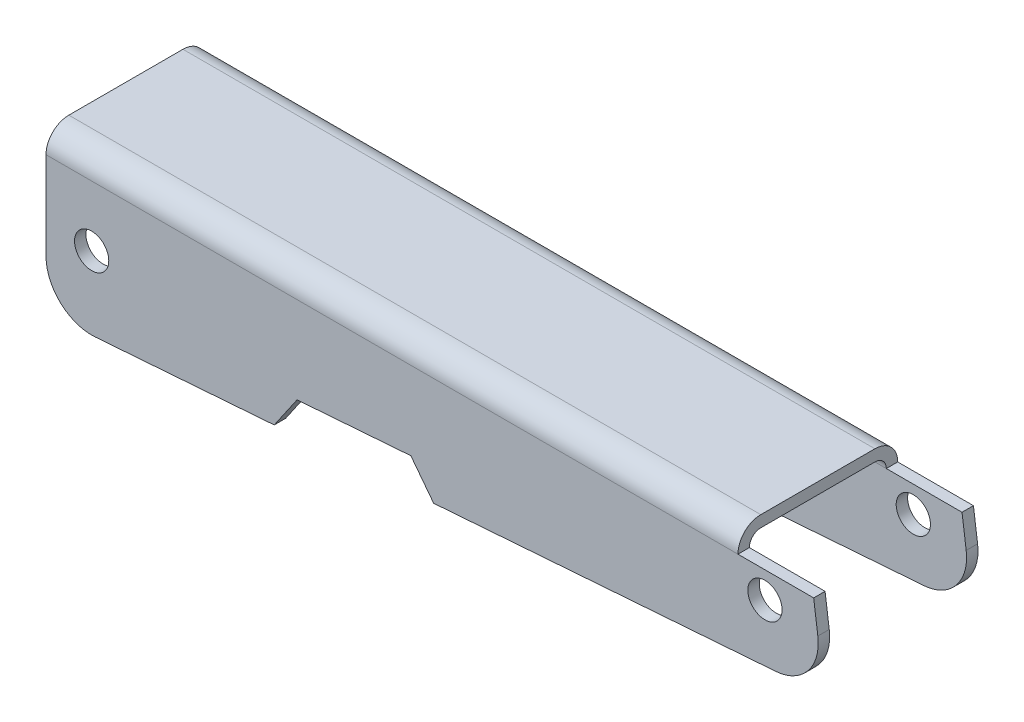
ISO-10303-21;
HEADER;
FILE_DESCRIPTION(('STEP AP214'),'2;1');
FILE_NAME('part.step','',(''),(''),'','','');
FILE_SCHEMA(('AUTOMOTIVE_DESIGN { 1 0 10303 214 1 1 1 1 }'));
ENDSEC;
DATA;
#1=APPLICATION_CONTEXT('core data for automotive mechanical design processes');
#2=APPLICATION_PROTOCOL_DEFINITION('international standard','automotive_design',2000,#1);
#3=PRODUCT_CONTEXT('',#1,'mechanical');
#4=PRODUCT('Part','Part','',(#3));
#5=PRODUCT_RELATED_PRODUCT_CATEGORY('part','',(#4));
#6=PRODUCT_DEFINITION_FORMATION('','',#4);
#7=PRODUCT_DEFINITION_CONTEXT('part definition',#1,'design');
#8=PRODUCT_DEFINITION('design','',#6,#7);
#9=PRODUCT_DEFINITION_SHAPE('','',#8);
#10=(LENGTH_UNIT() NAMED_UNIT(*) SI_UNIT(.MILLI.,.METRE.));
#11=(NAMED_UNIT(*) PLANE_ANGLE_UNIT() SI_UNIT($,.RADIAN.));
#12=(NAMED_UNIT(*) SI_UNIT($,.STERADIAN.) SOLID_ANGLE_UNIT());
#13=UNCERTAINTY_MEASURE_WITH_UNIT(LENGTH_MEASURE(1.E-05),#10,'distance_accuracy_value','');
#14=(GEOMETRIC_REPRESENTATION_CONTEXT(3) GLOBAL_UNCERTAINTY_ASSIGNED_CONTEXT((#13)) GLOBAL_UNIT_ASSIGNED_CONTEXT((#10,
#11,#12)) REPRESENTATION_CONTEXT('',''));
#15=CARTESIAN_POINT('',(0.,0.,0.));
#16=DIRECTION('',(0.,0.,1.));
#17=DIRECTION('',(1.,0.,0.));
#18=AXIS2_PLACEMENT_3D('',#15,#16,#17);
#19=CARTESIAN_POINT('',(5.2,-4.6196412483911,7.));
#20=DIRECTION('',(-0.991071249821234,-0.133333333333333,0.));
#21=DIRECTION('',(0.133333333333333,-0.991071249821234,0.));
#22=AXIS2_PLACEMENT_3D('',#19,#20,#21);
#23=PLANE('',#22);
#24=DIRECTION('',(-0.133333333333333,0.991071249821234,0.));
#25=VECTOR('',#24,1.);
#26=CARTESIAN_POINT('',(5.2,-4.6196412483911,-7.));
#27=LINE('',#26,#25);
#28=CARTESIAN_POINT('',(4.63402019570008,-0.412693908232891,-7.));
#29=VERTEX_POINT('',#28);
#30=CARTESIAN_POINT('',(4.26906911759852,2.3,-7.));
#31=VERTEX_POINT('',#30);
#32=EDGE_CURVE('E397',#29,#31,#27,.T.);
#33=ORIENTED_EDGE('',*,*,#32,.T.);
#34=DIRECTION('',(0.,0.,1.));
#35=VECTOR('',#34,1.);
#36=CARTESIAN_POINT('',(4.26906911759852,2.3,7.));
#37=LINE('',#36,#35);
#38=CARTESIAN_POINT('',(4.26906911759852,2.3,-6.));
#39=VERTEX_POINT('',#38);
#40=EDGE_CURVE('E499',#31,#39,#37,.T.);
#41=ORIENTED_EDGE('',*,*,#40,.T.);
#42=DIRECTION('',(-0.133333333333333,0.991071249821234,0.));
#43=VECTOR('',#42,1.);
#44=CARTESIAN_POINT('',(5.2,-4.6196412483911,-6.));
#45=LINE('',#44,#43);
#46=CARTESIAN_POINT('',(4.63402019570008,-0.412693908232891,-6.));
#47=VERTEX_POINT('',#46);
#48=EDGE_CURVE('E338',#47,#39,#45,.T.);
#49=ORIENTED_EDGE('',*,*,#48,.F.);
#50=DIRECTION('',(0.,0.,-1.));
#51=VECTOR('',#50,1.);
#52=CARTESIAN_POINT('',(4.63402019570008,-0.412693908232891,7.));
#53=LINE('',#52,#51);
#54=EDGE_CURVE('E304',#47,#29,#53,.T.);
#55=ORIENTED_EDGE('',*,*,#54,.T.);
#56=EDGE_LOOP('',(#33,#41,#49,#55));
#57=FACE_BOUND('',#56,.T.);
#58=ADVANCED_FACE('F69',(#57),#23,.F.);
#59=CARTESIAN_POINT('',(-63.,-9.70000000000001,7.));
#60=DIRECTION('',(-0.0742862392645329,0.997236960133314,0.));
#61=DIRECTION('',(-0.997236960133314,-0.0742862392645329,0.));
#62=AXIS2_PLACEMENT_3D('',#59,#60,#61);
#63=PLANE('',#62);
#64=DIRECTION('',(0.997236960133314,0.0742862392645329,0.));
#65=VECTOR('',#64,1.);
#66=CARTESIAN_POINT('',(-63.,-9.70000000000001,-7.));
#67=LINE('',#66,#65);
#68=CARTESIAN_POINT('',(-58.7028550429419,-9.3798968036727,-7.));
#69=VERTEX_POINT('',#68);
#70=CARTESIAN_POINT('',(-43.,-8.21015872386836,-7.));
#71=VERTEX_POINT('',#70);
#72=EDGE_CURVE('E330',#69,#71,#67,.T.);
#73=ORIENTED_EDGE('',*,*,#72,.T.);
#74=DIRECTION('',(0.,0.,1.));
#75=VECTOR('',#74,1.);
#76=CARTESIAN_POINT('',(-43.,-8.21015872386836,-7.));
#77=LINE('',#76,#75);
#78=CARTESIAN_POINT('',(-43.,-8.21015872386836,-6.));
#79=VERTEX_POINT('',#78);
#80=EDGE_CURVE('E317',#71,#79,#77,.T.);
#81=ORIENTED_EDGE('',*,*,#80,.T.);
#82=DIRECTION('',(0.997236960133314,0.0742862392645329,0.));
#83=VECTOR('',#82,1.);
#84=CARTESIAN_POINT('',(-63.,-9.70000000000001,-6.));
#85=LINE('',#84,#83);
#86=CARTESIAN_POINT('',(-58.7028550429419,-9.3798968036727,-6.));
#87=VERTEX_POINT('',#86);
#88=EDGE_CURVE('E327',#87,#79,#85,.T.);
#89=ORIENTED_EDGE('',*,*,#88,.F.);
#90=DIRECTION('',(0.,0.,-1.));
#91=VECTOR('',#90,1.);
#92=CARTESIAN_POINT('',(-58.7028550429419,-9.3798968036727,7.));
#93=LINE('',#92,#91);
#94=EDGE_CURVE('E287',#87,#69,#93,.T.);
#95=ORIENTED_EDGE('',*,*,#94,.T.);
#96=EDGE_LOOP('',(#73,#81,#89,#95));
#97=FACE_BOUND('',#96,.T.);
#98=ADVANCED_FACE('F326',(#97),#63,.F.);
#99=DIRECTION('',(0.997236960133314,0.0742862392645329,0.));
#100=VECTOR('',#99,1.);
#101=CARTESIAN_POINT('',(-63.,-9.70000000000001,6.));
#102=LINE('',#101,#100);
#103=CARTESIAN_POINT('',(-58.7028550429419,-9.3798968036727,6.));
#104=VERTEX_POINT('',#103);
#105=CARTESIAN_POINT('',(-43.,-8.21015872386836,6.));
#106=VERTEX_POINT('',#105);
#107=EDGE_CURVE('E355',#104,#106,#102,.T.);
#108=ORIENTED_EDGE('',*,*,#107,.T.);
#109=CARTESIAN_POINT('',(-43.,-8.21015872386836,7.));
#110=VERTEX_POINT('',#109);
#111=EDGE_CURVE('E332',#106,#110,#77,.T.);
#112=ORIENTED_EDGE('',*,*,#111,.T.);
#113=DIRECTION('',(0.997236960133314,0.0742862392645329,0.));
#114=VECTOR('',#113,1.);
#115=CARTESIAN_POINT('',(-63.,-9.70000000000001,7.));
#116=LINE('',#115,#114);
#117=CARTESIAN_POINT('',(-58.7028550429419,-9.3798968036727,7.));
#118=VERTEX_POINT('',#117);
#119=EDGE_CURVE('E388',#118,#110,#116,.T.);
#120=ORIENTED_EDGE('',*,*,#119,.F.);
#121=EDGE_CURVE('E288',#118,#104,#93,.T.);
#122=ORIENTED_EDGE('',*,*,#121,.T.);
#123=EDGE_LOOP('',(#108,#112,#120,#122));
#124=FACE_BOUND('',#123,.T.);
#125=ADVANCED_FACE('F539',(#124),#63,.F.);
#126=CARTESIAN_POINT('',(-29.0276303986669,-7.1693280759967,-6.));
#127=VERTEX_POINT('',#126);
#128=CARTESIAN_POINT('',(0.966880153473293,-4.93497508209948,-6.));
#129=VERTEX_POINT('',#128);
#130=EDGE_CURVE('E339',#127,#129,#85,.T.);
#131=ORIENTED_EDGE('',*,*,#130,.F.);
#132=DIRECTION('',(0.,0.,1.));
#133=VECTOR('',#132,1.);
#134=CARTESIAN_POINT('',(-29.0276303986669,-7.16932807599671,-7.));
#135=LINE('',#134,#133);
#136=CARTESIAN_POINT('',(-29.0276303986669,-7.16932807599671,-7.));
#137=VERTEX_POINT('',#136);
#138=EDGE_CURVE('E92',#137,#127,#135,.T.);
#139=ORIENTED_EDGE('',*,*,#138,.F.);
#140=CARTESIAN_POINT('',(0.966880153473279,-4.93497508209948,-7.));
#141=VERTEX_POINT('',#140);
#142=EDGE_CURVE('E385',#137,#141,#67,.T.);
#143=ORIENTED_EDGE('',*,*,#142,.T.);
#144=DIRECTION('',(0.,0.,-1.));
#145=VECTOR('',#144,1.);
#146=CARTESIAN_POINT('',(0.966880153473293,-4.93497508209948,7.));
#147=LINE('',#146,#145);
#148=EDGE_CURVE('E281',#141,#129,#147,.F.);
#149=ORIENTED_EDGE('',*,*,#148,.T.);
#150=EDGE_LOOP('',(#131,#139,#143,#149));
#151=FACE_BOUND('',#150,.T.);
#152=ADVANCED_FACE('F543',(#151),#63,.F.);
#153=DIRECTION('',(-0.133333333333333,0.991071249821234,0.));
#154=VECTOR('',#153,1.);
#155=CARTESIAN_POINT('',(5.2,-4.6196412483911,6.));
#156=LINE('',#155,#154);
#157=CARTESIAN_POINT('',(4.63402019570008,-0.412693908232891,6.));
#158=VERTEX_POINT('',#157);
#159=CARTESIAN_POINT('',(4.26906911759852,2.3,6.));
#160=VERTEX_POINT('',#159);
#161=EDGE_CURVE('E351',#158,#160,#156,.T.);
#162=ORIENTED_EDGE('',*,*,#161,.T.);
#163=CARTESIAN_POINT('',(4.26906911759852,2.3,7.));
#164=VERTEX_POINT('',#163);
#165=EDGE_CURVE('E496',#160,#164,#37,.T.);
#166=ORIENTED_EDGE('',*,*,#165,.T.);
#167=DIRECTION('',(-0.133333333333333,0.991071249821234,0.));
#168=VECTOR('',#167,1.);
#169=CARTESIAN_POINT('',(5.2,-4.6196412483911,7.));
#170=LINE('',#169,#168);
#171=CARTESIAN_POINT('',(4.63402019570008,-0.412693908232891,7.));
#172=VERTEX_POINT('',#171);
#173=EDGE_CURVE('E278',#172,#164,#170,.T.);
#174=ORIENTED_EDGE('',*,*,#173,.F.);
#175=EDGE_CURVE('E305',#172,#158,#53,.T.);
#176=ORIENTED_EDGE('',*,*,#175,.T.);
#177=EDGE_LOOP('',(#162,#166,#174,#176));
#178=FACE_BOUND('',#177,.T.);
#179=ADVANCED_FACE('F495',(#178),#23,.F.);
#180=CARTESIAN_POINT('',(-59.,-3.00000000000001,7.));
#181=DIRECTION('',(0.,0.,-1.));
#182=DIRECTION('',(-1.,0.,0.));
#183=AXIS2_PLACEMENT_3D('',#180,#181,#182);
#184=CYLINDRICAL_SURFACE('',#183,1.5);
#185=CARTESIAN_POINT('',(-59.,-3.00000000000001,-7.));
#186=DIRECTION('',(0.,0.,1.));
#187=DIRECTION('',(1.,0.,0.));
#188=AXIS2_PLACEMENT_3D('',#185,#186,#187);
#189=CIRCLE('',#188,1.5);
#190=CARTESIAN_POINT('',(-57.5,-3.00000000000001,-7.));
#191=VERTEX_POINT('',#190);
#192=EDGE_CURVE('E379',#191,#191,#189,.T.);
#193=ORIENTED_EDGE('',*,*,#192,.F.);
#194=EDGE_LOOP('',(#193));
#195=FACE_BOUND('',#194,.T.);
#196=CARTESIAN_POINT('',(-59.,-3.00000000000001,-6.));
#197=DIRECTION('',(0.,0.,1.));
#198=DIRECTION('',(1.,0.,0.));
#199=AXIS2_PLACEMENT_3D('',#196,#197,#198);
#200=CIRCLE('',#199,1.5);
#201=CARTESIAN_POINT('',(-57.5,-3.00000000000001,-6.));
#202=VERTEX_POINT('',#201);
#203=EDGE_CURVE('E369',#202,#202,#200,.T.);
#204=ORIENTED_EDGE('',*,*,#203,.T.);
#205=EDGE_LOOP('',(#204));
#206=FACE_BOUND('',#205,.T.);
#207=ADVANCED_FACE('F542',(#195,#206),#184,.F.);
#208=CARTESIAN_POINT('',(0.,0.,7.));
#209=DIRECTION('',(0.,0.,-1.));
#210=DIRECTION('',(-1.,0.,0.));
#211=AXIS2_PLACEMENT_3D('',#208,#209,#210);
#212=CYLINDRICAL_SURFACE('',#211,1.5);
#213=CARTESIAN_POINT('',(0.,0.,-7.));
#214=DIRECTION('',(0.,0.,1.));
#215=DIRECTION('',(1.,0.,0.));
#216=AXIS2_PLACEMENT_3D('',#213,#214,#215);
#217=CIRCLE('',#216,1.5);
#218=CARTESIAN_POINT('',(1.5,0.,-7.));
#219=VERTEX_POINT('',#218);
#220=EDGE_CURVE('E365',#219,#219,#217,.T.);
#221=ORIENTED_EDGE('',*,*,#220,.F.);
#222=EDGE_LOOP('',(#221));
#223=FACE_BOUND('',#222,.T.);
#224=CARTESIAN_POINT('',(0.,0.,-6.));
#225=DIRECTION('',(0.,0.,1.));
#226=DIRECTION('',(1.,0.,0.));
#227=AXIS2_PLACEMENT_3D('',#224,#225,#226);
#228=CIRCLE('',#227,1.5);
#229=CARTESIAN_POINT('',(1.5,0.,-6.));
#230=VERTEX_POINT('',#229);
#231=EDGE_CURVE('E370',#230,#230,#228,.T.);
#232=ORIENTED_EDGE('',*,*,#231,.T.);
#233=EDGE_LOOP('',(#232));
#234=FACE_BOUND('',#233,.T.);
#235=ADVANCED_FACE('F548',(#223,#234),#212,.F.);
#236=CARTESIAN_POINT('',(-59.,-5.39094896313944,7.));
#237=DIRECTION('',(0.,0.,-1.));
#238=DIRECTION('',(-1.,0.,0.));
#239=AXIS2_PLACEMENT_3D('',#236,#237,#238);
#240=CYLINDRICAL_SURFACE('',#239,4.);
#241=DIRECTION('',(0.,0.,-1.));
#242=VECTOR('',#241,1.);
#243=CARTESIAN_POINT('',(-63.,-5.39094896313944,7.));
#244=LINE('',#243,#242);
#245=CARTESIAN_POINT('',(-63.,-5.39094896313944,6.));
#246=VERTEX_POINT('',#245);
#247=CARTESIAN_POINT('',(-63.,-5.39094896313944,7.));
#248=VERTEX_POINT('',#247);
#249=EDGE_CURVE('E296',#246,#248,#244,.F.);
#250=ORIENTED_EDGE('',*,*,#249,.F.);
#251=CARTESIAN_POINT('',(-59.,-5.39094896313944,6.));
#252=DIRECTION('',(0.,0.,1.));
#253=DIRECTION('',(1.,0.,0.));
#254=AXIS2_PLACEMENT_3D('',#251,#252,#253);
#255=CIRCLE('',#254,4.);
#256=EDGE_CURVE('E359',#246,#104,#255,.T.);
#257=ORIENTED_EDGE('',*,*,#256,.T.);
#258=ORIENTED_EDGE('',*,*,#121,.F.);
#259=CARTESIAN_POINT('',(-59.,-5.39094896313944,7.));
#260=DIRECTION('',(0.,0.,1.));
#261=DIRECTION('',(1.,0.,0.));
#262=AXIS2_PLACEMENT_3D('',#259,#260,#261);
#263=CIRCLE('',#262,4.);
#264=EDGE_CURVE('E302',#248,#118,#263,.T.);
#265=ORIENTED_EDGE('',*,*,#264,.F.);
#266=EDGE_LOOP('',(#250,#257,#258,#265));
#267=FACE_BOUND('',#266,.T.);
#268=ADVANCED_FACE('F627',(#267),#240,.T.);
#269=ORIENTED_EDGE('',*,*,#94,.F.);
#270=CARTESIAN_POINT('',(-59.,-5.39094896313944,-6.));
#271=DIRECTION('',(0.,0.,1.));
#272=DIRECTION('',(1.,0.,0.));
#273=AXIS2_PLACEMENT_3D('',#270,#271,#272);
#274=CIRCLE('',#273,4.);
#275=CARTESIAN_POINT('',(-63.,-5.39094896313944,-6.));
#276=VERTEX_POINT('',#275);
#277=EDGE_CURVE('E337',#87,#276,#274,.F.);
#278=ORIENTED_EDGE('',*,*,#277,.T.);
#279=CARTESIAN_POINT('',(-63.,-5.39094896313944,-7.));
#280=VERTEX_POINT('',#279);
#281=EDGE_CURVE('E297',#280,#276,#244,.F.);
#282=ORIENTED_EDGE('',*,*,#281,.F.);
#283=CARTESIAN_POINT('',(-59.,-5.39094896313944,-7.));
#284=DIRECTION('',(0.,0.,1.));
#285=DIRECTION('',(1.,0.,0.));
#286=AXIS2_PLACEMENT_3D('',#283,#284,#285);
#287=CIRCLE('',#286,4.);
#288=EDGE_CURVE('E294',#69,#280,#287,.F.);
#289=ORIENTED_EDGE('',*,*,#288,.F.);
#290=EDGE_LOOP('',(#269,#278,#282,#289));
#291=FACE_BOUND('',#290,.T.);
#292=ADVANCED_FACE('F754',(#291),#240,.T.);
#293=CARTESIAN_POINT('',(0.66973519641515,-0.946027241566224,7.));
#294=DIRECTION('',(0.,0.,-1.));
#295=DIRECTION('',(-1.,0.,0.));
#296=AXIS2_PLACEMENT_3D('',#293,#294,#295);
#297=CYLINDRICAL_SURFACE('',#296,4.);
#298=CARTESIAN_POINT('',(0.966880153473293,-4.93497508209948,6.));
#299=VERTEX_POINT('',#298);
#300=CARTESIAN_POINT('',(0.966880153473279,-4.93497508209948,7.));
#301=VERTEX_POINT('',#300);
#302=EDGE_CURVE('E279',#299,#301,#147,.F.);
#303=ORIENTED_EDGE('',*,*,#302,.F.);
#304=CARTESIAN_POINT('',(0.66973519641515,-0.946027241566224,6.));
#305=DIRECTION('',(0.,0.,1.));
#306=DIRECTION('',(1.,0.,0.));
#307=AXIS2_PLACEMENT_3D('',#304,#305,#306);
#308=CIRCLE('',#307,4.);
#309=EDGE_CURVE('E356',#299,#158,#308,.T.);
#310=ORIENTED_EDGE('',*,*,#309,.T.);
#311=ORIENTED_EDGE('',*,*,#175,.F.);
#312=CARTESIAN_POINT('',(0.66973519641515,-0.946027241566224,7.));
#313=DIRECTION('',(0.,0.,1.));
#314=DIRECTION('',(1.,0.,0.));
#315=AXIS2_PLACEMENT_3D('',#312,#313,#314);
#316=CIRCLE('',#315,4.);
#317=EDGE_CURVE('E300',#301,#172,#316,.T.);
#318=ORIENTED_EDGE('',*,*,#317,.F.);
#319=EDGE_LOOP('',(#303,#310,#311,#318));
#320=FACE_BOUND('',#319,.T.);
#321=ADVANCED_FACE('F71',(#320),#297,.T.);
#322=ORIENTED_EDGE('',*,*,#54,.F.);
#323=CARTESIAN_POINT('',(0.66973519641515,-0.946027241566224,-6.));
#324=DIRECTION('',(0.,0.,1.));
#325=DIRECTION('',(1.,0.,0.));
#326=AXIS2_PLACEMENT_3D('',#323,#324,#325);
#327=CIRCLE('',#326,4.);
#328=EDGE_CURVE('E348',#47,#129,#327,.F.);
#329=ORIENTED_EDGE('',*,*,#328,.T.);
#330=ORIENTED_EDGE('',*,*,#148,.F.);
#331=CARTESIAN_POINT('',(0.66973519641515,-0.946027241566224,-7.));
#332=DIRECTION('',(0.,0.,1.));
#333=DIRECTION('',(1.,0.,0.));
#334=AXIS2_PLACEMENT_3D('',#331,#332,#333);
#335=CIRCLE('',#334,4.);
#336=EDGE_CURVE('E291',#29,#141,#335,.F.);
#337=ORIENTED_EDGE('',*,*,#336,.F.);
#338=EDGE_LOOP('',(#322,#329,#330,#337));
#339=FACE_BOUND('',#338,.T.);
#340=ADVANCED_FACE('F571',(#339),#297,.T.);
#341=CARTESIAN_POINT('',(0.,0.,7.));
#342=DIRECTION('',(0.,0.,1.));
#343=DIRECTION('',(1.,0.,0.));
#344=AXIS2_PLACEMENT_3D('',#341,#342,#343);
#345=PLANE('',#344);
#346=DIRECTION('',(-0.566857898826988,-0.823815587699973,0.));
#347=VECTOR('',#346,1.);
#348=CARTESIAN_POINT('',(-43.,-8.21015872386836,7.));
#349=LINE('',#348,#347);
#350=CARTESIAN_POINT('',(-41.,-5.30355518388166,7.));
#351=VERTEX_POINT('',#350);
#352=EDGE_CURVE('E435',#351,#110,#349,.T.);
#353=ORIENTED_EDGE('',*,*,#352,.F.);
#354=DIRECTION('',(-0.997236960133314,-0.0742862392645328,0.));
#355=VECTOR('',#354,1.);
#356=CARTESIAN_POINT('',(-41.,-5.30355518388166,7.));
#357=LINE('',#356,#355);
#358=CARTESIAN_POINT('',(-31.0276303986669,-4.56069279123634,7.));
#359=VERTEX_POINT('',#358);
#360=EDGE_CURVE('E429',#359,#351,#357,.T.);
#361=ORIENTED_EDGE('',*,*,#360,.F.);
#362=DIRECTION('',(-0.608440411247567,0.793599562727256,0.));
#363=VECTOR('',#362,1.);
#364=CARTESIAN_POINT('',(-31.0276303986669,-4.56069279123634,7.));
#365=LINE('',#364,#363);
#366=CARTESIAN_POINT('',(-29.0276303986669,-7.16932807599671,7.));
#367=VERTEX_POINT('',#366);
#368=EDGE_CURVE('E427',#367,#359,#365,.T.);
#369=ORIENTED_EDGE('',*,*,#368,.F.);
#370=EDGE_CURVE('E391',#367,#301,#116,.T.);
#371=ORIENTED_EDGE('',*,*,#370,.T.);
#372=ORIENTED_EDGE('',*,*,#317,.T.);
#373=ORIENTED_EDGE('',*,*,#173,.T.);
#374=DIRECTION('',(-1.,0.,0.));
#375=VECTOR('',#374,1.);
#376=CARTESIAN_POINT('',(-63.,2.29999999999999,7.));
#377=LINE('',#376,#375);
#378=CARTESIAN_POINT('',(-2.36597980429992,2.3,7.));
#379=VERTEX_POINT('',#378);
#380=EDGE_CURVE('E258',#164,#379,#377,.T.);
#381=ORIENTED_EDGE('',*,*,#380,.T.);
#382=CARTESIAN_POINT('',(-63.,2.29999999999999,7.));
#383=VERTEX_POINT('',#382);
#384=EDGE_CURVE('E265',#379,#383,#377,.T.);
#385=ORIENTED_EDGE('',*,*,#384,.T.);
#386=DIRECTION('',(0.,-1.,0.));
#387=VECTOR('',#386,1.);
#388=CARTESIAN_POINT('',(-63.,4.29999999999999,7.));
#389=LINE('',#388,#387);
#390=EDGE_CURVE('E393',#383,#248,#389,.T.);
#391=ORIENTED_EDGE('',*,*,#390,.T.);
#392=ORIENTED_EDGE('',*,*,#264,.T.);
#393=ORIENTED_EDGE('',*,*,#119,.T.);
#394=EDGE_LOOP('',(#353,#361,#369,#371,#372,#373,#381,#385,#391,#392,#393));
#395=FACE_BOUND('',#394,.T.);
#396=CARTESIAN_POINT('',(-59.,-3.00000000000001,7.));
#397=DIRECTION('',(0.,0.,1.));
#398=DIRECTION('',(1.,0.,0.));
#399=AXIS2_PLACEMENT_3D('',#396,#397,#398);
#400=CIRCLE('',#399,1.5);
#401=CARTESIAN_POINT('',(-57.5,-3.00000000000001,7.));
#402=VERTEX_POINT('',#401);
#403=EDGE_CURVE('E382',#402,#402,#400,.T.);
#404=ORIENTED_EDGE('',*,*,#403,.F.);
#405=EDGE_LOOP('',(#404));
#406=FACE_BOUND('',#405,.T.);
#407=CARTESIAN_POINT('',(0.,0.,7.));
#408=DIRECTION('',(0.,0.,1.));
#409=DIRECTION('',(1.,0.,0.));
#410=AXIS2_PLACEMENT_3D('',#407,#408,#409);
#411=CIRCLE('',#410,1.5);
#412=CARTESIAN_POINT('',(1.5,0.,7.));
#413=VERTEX_POINT('',#412);
#414=EDGE_CURVE('E376',#413,#413,#411,.T.);
#415=ORIENTED_EDGE('',*,*,#414,.F.);
#416=EDGE_LOOP('',(#415));
#417=FACE_BOUND('',#416,.T.);
#418=ADVANCED_FACE('F275',(#395,#406,#417),#345,.T.);
#419=CARTESIAN_POINT('',(0.,0.,-7.));
#420=DIRECTION('',(0.,0.,1.));
#421=DIRECTION('',(1.,0.,0.));
#422=AXIS2_PLACEMENT_3D('',#419,#420,#421);
#423=PLANE('',#422);
#424=DIRECTION('',(-0.997236960133314,-0.0742862392645328,0.));
#425=VECTOR('',#424,1.);
#426=CARTESIAN_POINT('',(-41.,-5.30355518388166,-7.));
#427=LINE('',#426,#425);
#428=CARTESIAN_POINT('',(-31.0276303986669,-4.56069279123634,-7.));
#429=VERTEX_POINT('',#428);
#430=CARTESIAN_POINT('',(-41.,-5.30355518388166,-7.));
#431=VERTEX_POINT('',#430);
#432=EDGE_CURVE('E440',#429,#431,#427,.T.);
#433=ORIENTED_EDGE('',*,*,#432,.T.);
#434=DIRECTION('',(-0.566857898826988,-0.823815587699973,0.));
#435=VECTOR('',#434,1.);
#436=CARTESIAN_POINT('',(-43.,-8.21015872386836,-7.));
#437=LINE('',#436,#435);
#438=EDGE_CURVE('E442',#431,#71,#437,.T.);
#439=ORIENTED_EDGE('',*,*,#438,.T.);
#440=ORIENTED_EDGE('',*,*,#72,.F.);
#441=ORIENTED_EDGE('',*,*,#288,.T.);
#442=DIRECTION('',(0.,-1.,0.));
#443=VECTOR('',#442,1.);
#444=CARTESIAN_POINT('',(-63.,4.29999999999999,-7.));
#445=LINE('',#444,#443);
#446=CARTESIAN_POINT('',(-63.,2.29999999999999,-7.));
#447=VERTEX_POINT('',#446);
#448=EDGE_CURVE('E400',#447,#280,#445,.T.);
#449=ORIENTED_EDGE('',*,*,#448,.F.);
#450=DIRECTION('',(-1.,0.,0.));
#451=VECTOR('',#450,1.);
#452=CARTESIAN_POINT('',(0.,2.3,-7.));
#453=LINE('',#452,#451);
#454=CARTESIAN_POINT('',(-2.36597980429992,2.3,-7.));
#455=VERTEX_POINT('',#454);
#456=EDGE_CURVE('E271',#447,#455,#453,.F.);
#457=ORIENTED_EDGE('',*,*,#456,.T.);
#458=DIRECTION('',(-1.,0.,0.));
#459=VECTOR('',#458,1.);
#460=CARTESIAN_POINT('',(-2.36597980429992,2.3,-7.));
#461=LINE('',#460,#459);
#462=EDGE_CURVE('E421',#31,#455,#461,.T.);
#463=ORIENTED_EDGE('',*,*,#462,.F.);
#464=ORIENTED_EDGE('',*,*,#32,.F.);
#465=ORIENTED_EDGE('',*,*,#336,.T.);
#466=ORIENTED_EDGE('',*,*,#142,.F.);
#467=DIRECTION('',(-0.608440411247567,0.793599562727256,0.));
#468=VECTOR('',#467,1.);
#469=CARTESIAN_POINT('',(-31.0276303986669,-4.56069279123634,-7.));
#470=LINE('',#469,#468);
#471=EDGE_CURVE('E437',#137,#429,#470,.T.);
#472=ORIENTED_EDGE('',*,*,#471,.T.);
#473=EDGE_LOOP('',(#433,#439,#440,#441,#449,#457,#463,#464,#465,#466,#472));
#474=FACE_BOUND('',#473,.T.);
#475=ORIENTED_EDGE('',*,*,#192,.T.);
#476=EDGE_LOOP('',(#475));
#477=FACE_BOUND('',#476,.T.);
#478=ORIENTED_EDGE('',*,*,#220,.T.);
#479=EDGE_LOOP('',(#478));
#480=FACE_BOUND('',#479,.T.);
#481=ADVANCED_FACE('F418',(#474,#477,#480),#423,.F.);
#482=ORIENTED_EDGE('',*,*,#370,.F.);
#483=CARTESIAN_POINT('',(-29.0276303986669,-7.16932807599671,6.));
#484=VERTEX_POINT('',#483);
#485=EDGE_CURVE('E443',#484,#367,#135,.T.);
#486=ORIENTED_EDGE('',*,*,#485,.F.);
#487=EDGE_CURVE('E362',#484,#299,#102,.T.);
#488=ORIENTED_EDGE('',*,*,#487,.T.);
#489=ORIENTED_EDGE('',*,*,#302,.T.);
#490=EDGE_LOOP('',(#482,#486,#488,#489));
#491=FACE_BOUND('',#490,.T.);
#492=ADVANCED_FACE('F485',(#491),#63,.F.);
#493=CARTESIAN_POINT('',(4.,4.3,7.));
#494=DIRECTION('',(0.,-1.,0.));
#495=DIRECTION('',(1.,0.,0.));
#496=AXIS2_PLACEMENT_3D('',#493,#494,#495);
#497=PLANE('',#496);
#498=DIRECTION('',(-1.,0.,0.));
#499=VECTOR('',#498,1.);
#500=CARTESIAN_POINT('',(4.,4.3,5.));
#501=LINE('',#500,#499);
#502=CARTESIAN_POINT('',(-63.,4.29999999999999,5.));
#503=VERTEX_POINT('',#502);
#504=CARTESIAN_POINT('',(-2.36597980429992,4.3,5.));
#505=VERTEX_POINT('',#504);
#506=EDGE_CURVE('E405',#503,#505,#501,.F.);
#507=ORIENTED_EDGE('',*,*,#506,.T.);
#508=DIRECTION('',(0.,0.,1.));
#509=VECTOR('',#508,1.);
#510=CARTESIAN_POINT('',(-2.36597980429992,4.3,7.));
#511=LINE('',#510,#509);
#512=CARTESIAN_POINT('',(-2.36597980429992,4.3,-5.));
#513=VERTEX_POINT('',#512);
#514=EDGE_CURVE('E247',#513,#505,#511,.T.);
#515=ORIENTED_EDGE('',*,*,#514,.F.);
#516=DIRECTION('',(-1.,0.,0.));
#517=VECTOR('',#516,1.);
#518=CARTESIAN_POINT('',(4.,4.3,-5.));
#519=LINE('',#518,#517);
#520=CARTESIAN_POINT('',(-63.,4.29999999999999,-5.));
#521=VERTEX_POINT('',#520);
#522=EDGE_CURVE('E407',#513,#521,#519,.T.);
#523=ORIENTED_EDGE('',*,*,#522,.T.);
#524=DIRECTION('',(0.,0.,-1.));
#525=VECTOR('',#524,1.);
#526=CARTESIAN_POINT('',(-63.,4.29999999999999,7.));
#527=LINE('',#526,#525);
#528=EDGE_CURVE('E395',#503,#521,#527,.T.);
#529=ORIENTED_EDGE('',*,*,#528,.F.);
#530=EDGE_LOOP('',(#507,#515,#523,#529));
#531=FACE_BOUND('',#530,.T.);
#532=ADVANCED_FACE('F561',(#531),#497,.F.);
#533=CARTESIAN_POINT('',(-63.,4.29999999999999,7.));
#534=DIRECTION('',(1.,0.,0.));
#535=DIRECTION('',(0.,0.,-1.));
#536=AXIS2_PLACEMENT_3D('',#533,#534,#535);
#537=PLANE('',#536);
#538=DIRECTION('',(0.,-1.,0.));
#539=VECTOR('',#538,1.);
#540=CARTESIAN_POINT('',(-63.,4.29999999999999,-6.));
#541=LINE('',#540,#539);
#542=CARTESIAN_POINT('',(-63.,2.29999999999999,-6.));
#543=VERTEX_POINT('',#542);
#544=EDGE_CURVE('E342',#543,#276,#541,.T.);
#545=ORIENTED_EDGE('',*,*,#544,.F.);
#546=CARTESIAN_POINT('',(-63.,2.29999999999999,-5.));
#547=DIRECTION('',(1.,0.,0.));
#548=DIRECTION('',(0.,0.,-1.));
#549=AXIS2_PLACEMENT_3D('',#546,#547,#548);
#550=CIRCLE('',#549,1.);
#551=CARTESIAN_POINT('',(-63.,3.29999999999999,-5.));
#552=VERTEX_POINT('',#551);
#553=EDGE_CURVE('E470',#552,#543,#550,.F.);
#554=ORIENTED_EDGE('',*,*,#553,.F.);
#555=DIRECTION('',(0.,0.,-1.));
#556=VECTOR('',#555,1.);
#557=CARTESIAN_POINT('',(-63.,3.29999999999999,7.));
#558=LINE('',#557,#556);
#559=CARTESIAN_POINT('',(-63.,3.29999999999999,5.));
#560=VERTEX_POINT('',#559);
#561=EDGE_CURVE('E464',#560,#552,#558,.T.);
#562=ORIENTED_EDGE('',*,*,#561,.F.);
#563=CARTESIAN_POINT('',(-63.,2.29999999999999,5.));
#564=DIRECTION('',(1.,0.,0.));
#565=DIRECTION('',(0.,0.,-1.));
#566=AXIS2_PLACEMENT_3D('',#563,#564,#565);
#567=CIRCLE('',#566,1.);
#568=CARTESIAN_POINT('',(-63.,2.29999999999999,6.));
#569=VERTEX_POINT('',#568);
#570=EDGE_CURVE('E466',#569,#560,#567,.F.);
#571=ORIENTED_EDGE('',*,*,#570,.F.);
#572=DIRECTION('',(0.,-1.,0.));
#573=VECTOR('',#572,1.);
#574=CARTESIAN_POINT('',(-63.,4.29999999999999,6.));
#575=LINE('',#574,#573);
#576=EDGE_CURVE('E354',#569,#246,#575,.T.);
#577=ORIENTED_EDGE('',*,*,#576,.T.);
#578=ORIENTED_EDGE('',*,*,#249,.T.);
#579=ORIENTED_EDGE('',*,*,#390,.F.);
#580=CARTESIAN_POINT('',(-63.,2.29999999999999,5.));
#581=DIRECTION('',(1.,0.,0.));
#582=DIRECTION('',(0.,0.,-1.));
#583=AXIS2_PLACEMENT_3D('',#580,#581,#582);
#584=CIRCLE('',#583,2.);
#585=EDGE_CURVE('E267',#383,#503,#584,.F.);
#586=ORIENTED_EDGE('',*,*,#585,.T.);
#587=ORIENTED_EDGE('',*,*,#528,.T.);
#588=CARTESIAN_POINT('',(-63.,2.29999999999999,-5.));
#589=DIRECTION('',(1.,0.,0.));
#590=DIRECTION('',(0.,0.,-1.));
#591=AXIS2_PLACEMENT_3D('',#588,#589,#590);
#592=CIRCLE('',#591,2.);
#593=EDGE_CURVE('E409',#521,#447,#592,.F.);
#594=ORIENTED_EDGE('',*,*,#593,.T.);
#595=ORIENTED_EDGE('',*,*,#448,.T.);
#596=ORIENTED_EDGE('',*,*,#281,.T.);
#597=EDGE_LOOP('',(#545,#554,#562,#571,#577,#578,#579,#586,#587,#594,#595,#596));
#598=FACE_BOUND('',#597,.T.);
#599=ADVANCED_FACE('F521',(#598),#537,.F.);
#600=CARTESIAN_POINT('',(-59.,-3.00000000000001,6.));
#601=DIRECTION('',(0.,0.,1.));
#602=DIRECTION('',(1.,0.,0.));
#603=AXIS2_PLACEMENT_3D('',#600,#601,#602);
#604=CIRCLE('',#603,1.5);
#605=CARTESIAN_POINT('',(-57.5,-3.00000000000001,6.));
#606=VERTEX_POINT('',#605);
#607=EDGE_CURVE('E344',#606,#606,#604,.T.);
#608=ORIENTED_EDGE('',*,*,#607,.F.);
#609=EDGE_LOOP('',(#608));
#610=FACE_BOUND('',#609,.T.);
#611=ORIENTED_EDGE('',*,*,#403,.T.);
#612=EDGE_LOOP('',(#611));
#613=FACE_BOUND('',#612,.T.);
#614=ADVANCED_FACE('F551',(#610,#613),#184,.F.);
#615=CARTESIAN_POINT('',(0.,0.,6.));
#616=DIRECTION('',(0.,0.,1.));
#617=DIRECTION('',(1.,0.,0.));
#618=AXIS2_PLACEMENT_3D('',#615,#616,#617);
#619=CIRCLE('',#618,1.5);
#620=CARTESIAN_POINT('',(1.5,0.,6.));
#621=VERTEX_POINT('',#620);
#622=EDGE_CURVE('E366',#621,#621,#619,.T.);
#623=ORIENTED_EDGE('',*,*,#622,.F.);
#624=EDGE_LOOP('',(#623));
#625=FACE_BOUND('',#624,.T.);
#626=ORIENTED_EDGE('',*,*,#414,.T.);
#627=EDGE_LOOP('',(#626));
#628=FACE_BOUND('',#627,.T.);
#629=ADVANCED_FACE('F579',(#625,#628),#212,.F.);
#630=CARTESIAN_POINT('',(4.,2.3,-5.));
#631=DIRECTION('',(-1.,0.,0.));
#632=DIRECTION('',(0.,-1.,0.));
#633=AXIS2_PLACEMENT_3D('',#630,#631,#632);
#634=CYLINDRICAL_SURFACE('',#633,2.);
#635=CARTESIAN_POINT('',(-2.36597980429992,2.3,-5.));
#636=DIRECTION('',(-1.,0.,0.));
#637=DIRECTION('',(0.,-1.,0.));
#638=AXIS2_PLACEMENT_3D('',#635,#636,#637);
#639=CIRCLE('',#638,2.);
#640=EDGE_CURVE('E252',#455,#513,#639,.F.);
#641=ORIENTED_EDGE('',*,*,#640,.F.);
#642=ORIENTED_EDGE('',*,*,#456,.F.);
#643=ORIENTED_EDGE('',*,*,#593,.F.);
#644=ORIENTED_EDGE('',*,*,#522,.F.);
#645=EDGE_LOOP('',(#641,#642,#643,#644));
#646=FACE_BOUND('',#645,.T.);
#647=ADVANCED_FACE('F424',(#646),#634,.T.);
#648=CARTESIAN_POINT('',(0.,2.3,5.));
#649=DIRECTION('',(1.,0.,0.));
#650=DIRECTION('',(0.,1.,0.));
#651=AXIS2_PLACEMENT_3D('',#648,#649,#650);
#652=CYLINDRICAL_SURFACE('',#651,2.);
#653=CARTESIAN_POINT('',(-2.36597980429992,2.3,5.));
#654=DIRECTION('',(-1.,0.,0.));
#655=DIRECTION('',(0.,-1.,0.));
#656=AXIS2_PLACEMENT_3D('',#653,#654,#655);
#657=CIRCLE('',#656,2.);
#658=EDGE_CURVE('E242',#505,#379,#657,.F.);
#659=ORIENTED_EDGE('',*,*,#658,.F.);
#660=ORIENTED_EDGE('',*,*,#506,.F.);
#661=ORIENTED_EDGE('',*,*,#585,.F.);
#662=ORIENTED_EDGE('',*,*,#384,.F.);
#663=EDGE_LOOP('',(#659,#660,#661,#662));
#664=FACE_BOUND('',#663,.T.);
#665=ADVANCED_FACE('F266',(#664),#652,.T.);
#666=CARTESIAN_POINT('',(0.,0.,6.));
#667=DIRECTION('',(0.,0.,1.));
#668=DIRECTION('',(1.,0.,0.));
#669=AXIS2_PLACEMENT_3D('',#666,#667,#668);
#670=PLANE('',#669);
#671=ORIENTED_EDGE('',*,*,#607,.T.);
#672=EDGE_LOOP('',(#671));
#673=FACE_BOUND('',#672,.T.);
#674=DIRECTION('',(-0.997236960133314,-0.0742862392645328,0.));
#675=VECTOR('',#674,1.);
#676=CARTESIAN_POINT('',(0.166636324558106,-2.23696748409032,6.));
#677=LINE('',#676,#675);
#678=CARTESIAN_POINT('',(-31.0276303986669,-4.56069279123634,6.));
#679=VERTEX_POINT('',#678);
#680=CARTESIAN_POINT('',(-41.,-5.30355518388166,6.));
#681=VERTEX_POINT('',#680);
#682=EDGE_CURVE('E453',#679,#681,#677,.T.);
#683=ORIENTED_EDGE('',*,*,#682,.T.);
#684=DIRECTION('',(-0.566857898826989,-0.823815587699973,0.));
#685=VECTOR('',#684,1.);
#686=CARTESIAN_POINT('',(-25.348869024367,17.4422611654034,6.));
#687=LINE('',#686,#685);
#688=EDGE_CURVE('E375',#681,#106,#687,.T.);
#689=ORIENTED_EDGE('',*,*,#688,.T.);
#690=ORIENTED_EDGE('',*,*,#107,.F.);
#691=ORIENTED_EDGE('',*,*,#256,.F.);
#692=ORIENTED_EDGE('',*,*,#576,.F.);
#693=DIRECTION('',(1.,0.,0.));
#694=VECTOR('',#693,1.);
#695=CARTESIAN_POINT('',(0.,2.3,6.));
#696=LINE('',#695,#694);
#697=CARTESIAN_POINT('',(-2.36597980429992,2.3,6.));
#698=VERTEX_POINT('',#697);
#699=EDGE_CURVE('E459',#698,#569,#696,.F.);
#700=ORIENTED_EDGE('',*,*,#699,.F.);
#701=EDGE_CURVE('E261',#160,#698,#696,.F.);
#702=ORIENTED_EDGE('',*,*,#701,.F.);
#703=ORIENTED_EDGE('',*,*,#161,.F.);
#704=ORIENTED_EDGE('',*,*,#309,.F.);
#705=ORIENTED_EDGE('',*,*,#487,.F.);
#706=DIRECTION('',(-0.608440411247567,0.793599562727256,0.));
#707=VECTOR('',#706,1.);
#708=CARTESIAN_POINT('',(-21.7433770790993,-16.6703081922751,6.));
#709=LINE('',#708,#707);
#710=EDGE_CURVE('E331',#484,#679,#709,.T.);
#711=ORIENTED_EDGE('',*,*,#710,.T.);
#712=EDGE_LOOP('',(#683,#689,#690,#691,#692,#700,#702,#703,#704,#705,#711));
#713=FACE_BOUND('',#712,.T.);
#714=ORIENTED_EDGE('',*,*,#622,.T.);
#715=EDGE_LOOP('',(#714));
#716=FACE_BOUND('',#715,.T.);
#717=ADVANCED_FACE('F489',(#673,#713,#716),#670,.F.);
#718=CARTESIAN_POINT('',(0.,0.,-6.));
#719=DIRECTION('',(0.,0.,1.));
#720=DIRECTION('',(1.,0.,0.));
#721=AXIS2_PLACEMENT_3D('',#718,#719,#720);
#722=PLANE('',#721);
#723=DIRECTION('',(-0.566857898826989,-0.823815587699973,0.));
#724=VECTOR('',#723,1.);
#725=CARTESIAN_POINT('',(-25.348869024367,17.4422611654034,-6.));
#726=LINE('',#725,#724);
#727=CARTESIAN_POINT('',(-41.,-5.30355518388166,-6.));
#728=VERTEX_POINT('',#727);
#729=EDGE_CURVE('E77',#728,#79,#726,.T.);
#730=ORIENTED_EDGE('',*,*,#729,.F.);
#731=DIRECTION('',(-0.997236960133314,-0.0742862392645328,0.));
#732=VECTOR('',#731,1.);
#733=CARTESIAN_POINT('',(0.166636324558106,-2.23696748409032,-6.));
#734=LINE('',#733,#732);
#735=CARTESIAN_POINT('',(-31.0276303986669,-4.56069279123634,-6.));
#736=VERTEX_POINT('',#735);
#737=EDGE_CURVE('E310',#736,#728,#734,.T.);
#738=ORIENTED_EDGE('',*,*,#737,.F.);
#739=DIRECTION('',(-0.608440411247567,0.793599562727256,0.));
#740=VECTOR('',#739,1.);
#741=CARTESIAN_POINT('',(-21.7433770790993,-16.6703081922751,-6.));
#742=LINE('',#741,#740);
#743=EDGE_CURVE('E308',#127,#736,#742,.T.);
#744=ORIENTED_EDGE('',*,*,#743,.F.);
#745=ORIENTED_EDGE('',*,*,#130,.T.);
#746=ORIENTED_EDGE('',*,*,#328,.F.);
#747=ORIENTED_EDGE('',*,*,#48,.T.);
#748=DIRECTION('',(-1.,0.,0.));
#749=VECTOR('',#748,1.);
#750=CARTESIAN_POINT('',(4.,2.3,-6.));
#751=LINE('',#750,#749);
#752=CARTESIAN_POINT('',(-2.36597980429992,2.3,-6.));
#753=VERTEX_POINT('',#752);
#754=EDGE_CURVE('E497',#39,#753,#751,.T.);
#755=ORIENTED_EDGE('',*,*,#754,.T.);
#756=DIRECTION('',(1.,0.,0.));
#757=VECTOR('',#756,1.);
#758=CARTESIAN_POINT('',(0.,2.29999999999999,-6.));
#759=LINE('',#758,#757);
#760=EDGE_CURVE('E467',#543,#753,#759,.T.);
#761=ORIENTED_EDGE('',*,*,#760,.F.);
#762=ORIENTED_EDGE('',*,*,#544,.T.);
#763=ORIENTED_EDGE('',*,*,#277,.F.);
#764=ORIENTED_EDGE('',*,*,#88,.T.);
#765=EDGE_LOOP('',(#730,#738,#744,#745,#746,#747,#755,#761,#762,#763,#764));
#766=FACE_BOUND('',#765,.T.);
#767=ORIENTED_EDGE('',*,*,#203,.F.);
#768=EDGE_LOOP('',(#767));
#769=FACE_BOUND('',#768,.T.);
#770=ORIENTED_EDGE('',*,*,#231,.F.);
#771=EDGE_LOOP('',(#770));
#772=FACE_BOUND('',#771,.T.);
#773=ADVANCED_FACE('F334',(#766,#769,#772),#722,.T.);
#774=CARTESIAN_POINT('',(4.,3.3,7.));
#775=DIRECTION('',(0.,-1.,0.));
#776=DIRECTION('',(1.,0.,0.));
#777=AXIS2_PLACEMENT_3D('',#774,#775,#776);
#778=PLANE('',#777);
#779=DIRECTION('',(0.,0.,-1.));
#780=VECTOR('',#779,1.);
#781=CARTESIAN_POINT('',(-2.36597980429992,3.3,7.));
#782=LINE('',#781,#780);
#783=CARTESIAN_POINT('',(-2.36597980429992,3.3,5.));
#784=VERTEX_POINT('',#783);
#785=CARTESIAN_POINT('',(-2.36597980429992,3.3,-5.));
#786=VERTEX_POINT('',#785);
#787=EDGE_CURVE('E505',#784,#786,#782,.T.);
#788=ORIENTED_EDGE('',*,*,#787,.F.);
#789=DIRECTION('',(1.,0.,0.));
#790=VECTOR('',#789,1.);
#791=CARTESIAN_POINT('',(4.,3.3,5.));
#792=LINE('',#791,#790);
#793=EDGE_CURVE('E460',#560,#784,#792,.T.);
#794=ORIENTED_EDGE('',*,*,#793,.F.);
#795=ORIENTED_EDGE('',*,*,#561,.T.);
#796=DIRECTION('',(1.,0.,0.));
#797=VECTOR('',#796,1.);
#798=CARTESIAN_POINT('',(4.,3.3,-5.));
#799=LINE('',#798,#797);
#800=EDGE_CURVE('E463',#786,#552,#799,.F.);
#801=ORIENTED_EDGE('',*,*,#800,.F.);
#802=EDGE_LOOP('',(#788,#794,#795,#801));
#803=FACE_BOUND('',#802,.T.);
#804=ADVANCED_FACE('F516',(#803),#778,.T.);
#805=CARTESIAN_POINT('',(4.,2.3,-5.));
#806=DIRECTION('',(-1.,0.,0.));
#807=DIRECTION('',(0.,-1.,0.));
#808=AXIS2_PLACEMENT_3D('',#805,#806,#807);
#809=CYLINDRICAL_SURFACE('',#808,1.);
#810=ORIENTED_EDGE('',*,*,#760,.T.);
#811=CARTESIAN_POINT('',(-2.36597980429992,2.3,-5.));
#812=DIRECTION('',(-1.,0.,0.));
#813=DIRECTION('',(0.,-1.,0.));
#814=AXIS2_PLACEMENT_3D('',#811,#812,#813);
#815=CIRCLE('',#814,1.);
#816=EDGE_CURVE('E253',#753,#786,#815,.F.);
#817=ORIENTED_EDGE('',*,*,#816,.T.);
#818=ORIENTED_EDGE('',*,*,#800,.T.);
#819=ORIENTED_EDGE('',*,*,#553,.T.);
#820=EDGE_LOOP('',(#810,#817,#818,#819));
#821=FACE_BOUND('',#820,.T.);
#822=ADVANCED_FACE('F513',(#821),#809,.F.);
#823=CARTESIAN_POINT('',(0.,2.3,5.));
#824=DIRECTION('',(1.,0.,0.));
#825=DIRECTION('',(0.,1.,0.));
#826=AXIS2_PLACEMENT_3D('',#823,#824,#825);
#827=CYLINDRICAL_SURFACE('',#826,1.);
#828=ORIENTED_EDGE('',*,*,#793,.T.);
#829=CARTESIAN_POINT('',(-2.36597980429992,2.3,5.));
#830=DIRECTION('',(-1.,0.,0.));
#831=DIRECTION('',(0.,-1.,0.));
#832=AXIS2_PLACEMENT_3D('',#829,#830,#831);
#833=CIRCLE('',#832,1.);
#834=EDGE_CURVE('E12',#784,#698,#833,.F.);
#835=ORIENTED_EDGE('',*,*,#834,.T.);
#836=ORIENTED_EDGE('',*,*,#699,.T.);
#837=ORIENTED_EDGE('',*,*,#570,.T.);
#838=EDGE_LOOP('',(#828,#835,#836,#837));
#839=FACE_BOUND('',#838,.T.);
#840=ADVANCED_FACE('F589',(#839),#827,.F.);
#841=CARTESIAN_POINT('',(-31.0276303986669,-4.56069279123634,-7.));
#842=DIRECTION('',(0.793599562727256,0.608440411247567,0.));
#843=DIRECTION('',(-0.608440411247567,0.793599562727256,0.));
#844=AXIS2_PLACEMENT_3D('',#841,#842,#843);
#845=PLANE('',#844);
#846=ORIENTED_EDGE('',*,*,#743,.T.);
#847=DIRECTION('',(0.,0.,1.));
#848=VECTOR('',#847,1.);
#849=CARTESIAN_POINT('',(-31.0276303986669,-4.56069279123634,-7.));
#850=LINE('',#849,#848);
#851=EDGE_CURVE('E447',#429,#736,#850,.T.);
#852=ORIENTED_EDGE('',*,*,#851,.F.);
#853=ORIENTED_EDGE('',*,*,#471,.F.);
#854=ORIENTED_EDGE('',*,*,#138,.T.);
#855=EDGE_LOOP('',(#846,#852,#853,#854));
#856=FACE_BOUND('',#855,.T.);
#857=ADVANCED_FACE('F592',(#856),#845,.F.);
#858=CARTESIAN_POINT('',(-41.,-5.30355518388166,-7.));
#859=DIRECTION('',(-0.0742862392645328,0.997236960133314,0.));
#860=DIRECTION('',(-0.997236960133314,-0.0742862392645328,0.));
#861=AXIS2_PLACEMENT_3D('',#858,#859,#860);
#862=PLANE('',#861);
#863=ORIENTED_EDGE('',*,*,#737,.T.);
#864=DIRECTION('',(0.,0.,1.));
#865=VECTOR('',#864,1.);
#866=CARTESIAN_POINT('',(-41.,-5.30355518388166,-7.));
#867=LINE('',#866,#865);
#868=EDGE_CURVE('E319',#431,#728,#867,.T.);
#869=ORIENTED_EDGE('',*,*,#868,.F.);
#870=ORIENTED_EDGE('',*,*,#432,.F.);
#871=ORIENTED_EDGE('',*,*,#851,.T.);
#872=EDGE_LOOP('',(#863,#869,#870,#871));
#873=FACE_BOUND('',#872,.T.);
#874=ADVANCED_FACE('F604',(#873),#862,.F.);
#875=CARTESIAN_POINT('',(-43.,-8.21015872386836,-7.));
#876=DIRECTION('',(-0.823815587699973,0.566857898826989,0.));
#877=DIRECTION('',(-0.566857898826989,-0.823815587699973,0.));
#878=AXIS2_PLACEMENT_3D('',#875,#876,#877);
#879=PLANE('',#878);
#880=ORIENTED_EDGE('',*,*,#729,.T.);
#881=ORIENTED_EDGE('',*,*,#80,.F.);
#882=ORIENTED_EDGE('',*,*,#438,.F.);
#883=ORIENTED_EDGE('',*,*,#868,.T.);
#884=EDGE_LOOP('',(#880,#881,#882,#883));
#885=FACE_BOUND('',#884,.T.);
#886=ADVANCED_FACE('F315',(#885),#879,.F.);
#887=EDGE_CURVE('E446',#681,#351,#867,.T.);
#888=ORIENTED_EDGE('',*,*,#887,.T.);
#889=ORIENTED_EDGE('',*,*,#352,.T.);
#890=ORIENTED_EDGE('',*,*,#111,.F.);
#891=ORIENTED_EDGE('',*,*,#688,.F.);
#892=EDGE_LOOP('',(#888,#889,#890,#891));
#893=FACE_BOUND('',#892,.T.);
#894=ADVANCED_FACE('F610',(#893),#879,.F.);
#895=EDGE_CURVE('E84',#679,#359,#850,.T.);
#896=ORIENTED_EDGE('',*,*,#895,.T.);
#897=ORIENTED_EDGE('',*,*,#360,.T.);
#898=ORIENTED_EDGE('',*,*,#887,.F.);
#899=ORIENTED_EDGE('',*,*,#682,.F.);
#900=EDGE_LOOP('',(#896,#897,#898,#899));
#901=FACE_BOUND('',#900,.T.);
#902=ADVANCED_FACE('F608',(#901),#862,.F.);
#903=ORIENTED_EDGE('',*,*,#485,.T.);
#904=ORIENTED_EDGE('',*,*,#368,.T.);
#905=ORIENTED_EDGE('',*,*,#895,.F.);
#906=ORIENTED_EDGE('',*,*,#710,.F.);
#907=EDGE_LOOP('',(#903,#904,#905,#906));
#908=FACE_BOUND('',#907,.T.);
#909=ADVANCED_FACE('F530',(#908),#845,.F.);
#910=CARTESIAN_POINT('',(-2.36597980429992,2.3,7.));
#911=DIRECTION('',(-1.,0.,0.));
#912=DIRECTION('',(0.,-1.,0.));
#913=AXIS2_PLACEMENT_3D('',#910,#911,#912);
#914=PLANE('',#913);
#915=ORIENTED_EDGE('',*,*,#640,.T.);
#916=ORIENTED_EDGE('',*,*,#514,.T.);
#917=ORIENTED_EDGE('',*,*,#658,.T.);
#918=DIRECTION('',(0.,0.,1.));
#919=VECTOR('',#918,1.);
#920=CARTESIAN_POINT('',(-2.36597980429992,2.3,7.));
#921=LINE('',#920,#919);
#922=EDGE_CURVE('E245',#698,#379,#921,.T.);
#923=ORIENTED_EDGE('',*,*,#922,.F.);
#924=ORIENTED_EDGE('',*,*,#834,.F.);
#925=ORIENTED_EDGE('',*,*,#787,.T.);
#926=ORIENTED_EDGE('',*,*,#816,.F.);
#927=EDGE_CURVE('E262',#455,#753,#921,.T.);
#928=ORIENTED_EDGE('',*,*,#927,.F.);
#929=EDGE_LOOP('',(#915,#916,#917,#923,#924,#925,#926,#928));
#930=FACE_BOUND('',#929,.T.);
#931=ADVANCED_FACE('F244',(#930),#914,.F.);
#932=CARTESIAN_POINT('',(0.,2.3,0.));
#933=DIRECTION('',(0.,-1.,0.));
#934=DIRECTION('',(1.,0.,0.));
#935=AXIS2_PLACEMENT_3D('',#932,#933,#934);
#936=PLANE('',#935);
#937=ORIENTED_EDGE('',*,*,#462,.T.);
#938=ORIENTED_EDGE('',*,*,#927,.T.);
#939=ORIENTED_EDGE('',*,*,#754,.F.);
#940=ORIENTED_EDGE('',*,*,#40,.F.);
#941=EDGE_LOOP('',(#937,#938,#939,#940));
#942=FACE_BOUND('',#941,.T.);
#943=ADVANCED_FACE('F523',(#942),#936,.F.);
#944=ORIENTED_EDGE('',*,*,#701,.T.);
#945=ORIENTED_EDGE('',*,*,#922,.T.);
#946=ORIENTED_EDGE('',*,*,#380,.F.);
#947=ORIENTED_EDGE('',*,*,#165,.F.);
#948=EDGE_LOOP('',(#944,#945,#946,#947));
#949=FACE_BOUND('',#948,.T.);
#950=ADVANCED_FACE('F256',(#949),#936,.F.);
#951=CLOSED_SHELL('',(#58,#98,#125,#152,#179,#207,#235,#268,#292,#321,#340,#418,#481,#492,#532,
#599,#614,#629,#647,#665,#717,#773,#804,#822,#840,#857,#874,#886,#894,#902,#909,#931,#943,#950));
#952=MANIFOLD_SOLID_BREP('B2',#951);
#953=ADVANCED_BREP_SHAPE_REPRESENTATION('',(#18,#952),#14);
#954=SHAPE_DEFINITION_REPRESENTATION(#9,#953);
ENDSEC;
END-ISO-10303-21;
